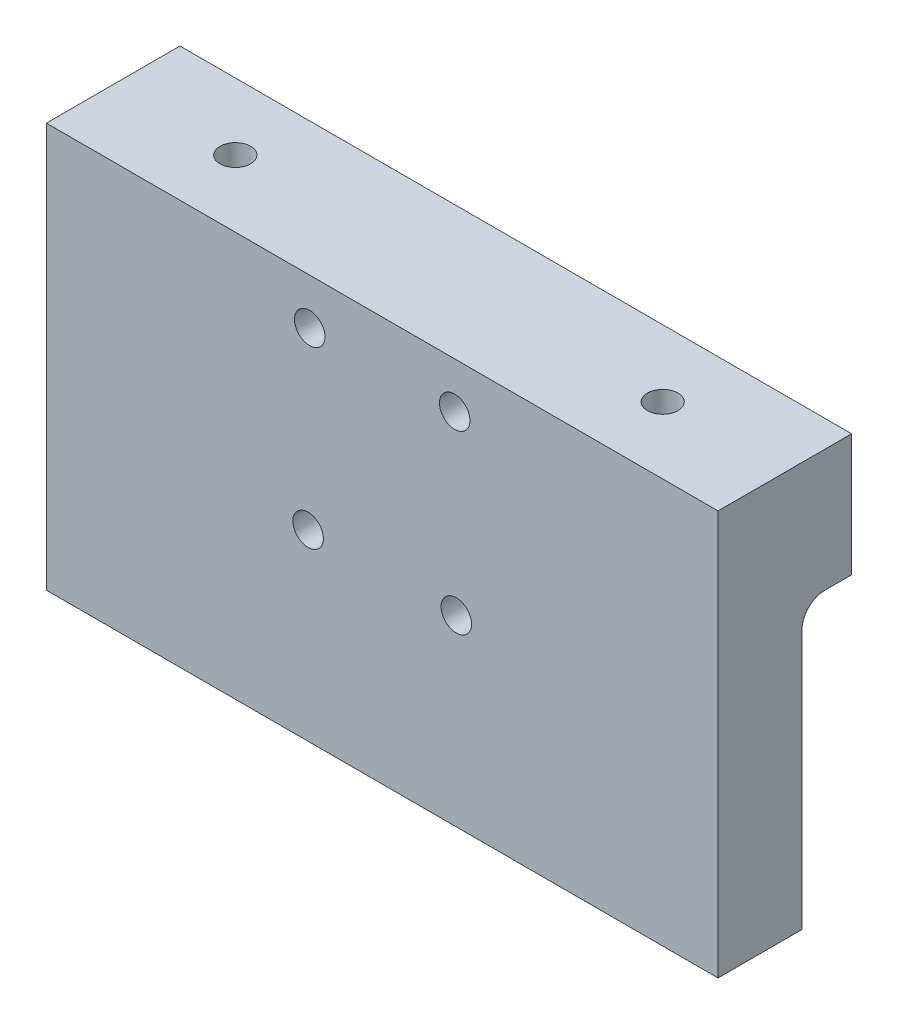
ISO-10303-21;
HEADER;
FILE_DESCRIPTION(('STEP AP214'),'2;1');
FILE_NAME('part.step','',(''),(''),'','','');
FILE_SCHEMA(('AUTOMOTIVE_DESIGN { 1 0 10303 214 1 1 1 1 }'));
ENDSEC;
DATA;
#1=APPLICATION_CONTEXT('core data for automotive mechanical design processes');
#2=APPLICATION_PROTOCOL_DEFINITION('international standard','automotive_design',2000,#1);
#3=PRODUCT_CONTEXT('',#1,'mechanical');
#4=PRODUCT('Part','Part','',(#3));
#5=PRODUCT_RELATED_PRODUCT_CATEGORY('part','',(#4));
#6=PRODUCT_DEFINITION_FORMATION('','',#4);
#7=PRODUCT_DEFINITION_CONTEXT('part definition',#1,'design');
#8=PRODUCT_DEFINITION('design','',#6,#7);
#9=PRODUCT_DEFINITION_SHAPE('','',#8);
#10=(LENGTH_UNIT() NAMED_UNIT(*) SI_UNIT(.MILLI.,.METRE.));
#11=(NAMED_UNIT(*) PLANE_ANGLE_UNIT() SI_UNIT($,.RADIAN.));
#12=(NAMED_UNIT(*) SI_UNIT($,.STERADIAN.) SOLID_ANGLE_UNIT());
#13=UNCERTAINTY_MEASURE_WITH_UNIT(LENGTH_MEASURE(1.E-05),#10,'distance_accuracy_value','');
#14=(GEOMETRIC_REPRESENTATION_CONTEXT(3) GLOBAL_UNCERTAINTY_ASSIGNED_CONTEXT((#13)) GLOBAL_UNIT_ASSIGNED_CONTEXT((#10,
#11,#12)) REPRESENTATION_CONTEXT('',''));
#15=CARTESIAN_POINT('',(0.,0.,0.));
#16=DIRECTION('',(0.,0.,1.));
#17=DIRECTION('',(1.,0.,0.));
#18=AXIS2_PLACEMENT_3D('',#15,#16,#17);
#19=CARTESIAN_POINT('',(176.,53.,11.));
#20=DIRECTION('',(0.,0.,-1.));
#21=DIRECTION('',(0.,1.,0.));
#22=AXIS2_PLACEMENT_3D('',#19,#20,#21);
#23=PLANE('',#22);
#24=CARTESIAN_POINT('',(107.,41.,11.));
#25=DIRECTION('',(0.,0.,-1.));
#26=DIRECTION('',(0.,1.,0.));
#27=AXIS2_PLACEMENT_3D('',#24,#25,#26);
#28=CIRCLE('',#27,4.00000000000001);
#29=CARTESIAN_POINT('',(107.,45.,11.));
#30=VERTEX_POINT('',#29);
#31=EDGE_CURVE('E155',#30,#30,#28,.T.);
#32=ORIENTED_EDGE('',*,*,#31,.T.);
#33=EDGE_LOOP('',(#32));
#34=FACE_BOUND('',#33,.T.);
#35=CARTESIAN_POINT('',(68.5806110348248,-5.00000000000001,11.));
#36=DIRECTION('',(0.,0.,-1.));
#37=DIRECTION('',(0.,1.,0.));
#38=AXIS2_PLACEMENT_3D('',#35,#36,#37);
#39=CIRCLE('',#38,4.00000000000001);
#40=CARTESIAN_POINT('',(68.5806110348248,-0.999999999999999,11.));
#41=VERTEX_POINT('',#40);
#42=EDGE_CURVE('E129',#41,#41,#39,.T.);
#43=ORIENTED_EDGE('',*,*,#42,.T.);
#44=EDGE_LOOP('',(#43));
#45=FACE_BOUND('',#44,.T.);
#46=CARTESIAN_POINT('',(107.419388965175,-5.00000000000001,11.));
#47=DIRECTION('',(0.,0.,-1.));
#48=DIRECTION('',(0.,1.,0.));
#49=AXIS2_PLACEMENT_3D('',#46,#47,#48);
#50=CIRCLE('',#49,4.00000000000001);
#51=CARTESIAN_POINT('',(107.419388965175,-0.999999999999999,11.));
#52=VERTEX_POINT('',#51);
#53=EDGE_CURVE('E158',#52,#52,#50,.T.);
#54=ORIENTED_EDGE('',*,*,#53,.T.);
#55=EDGE_LOOP('',(#54));
#56=FACE_BOUND('',#55,.T.);
#57=CARTESIAN_POINT('',(69.,41.,11.));
#58=DIRECTION('',(0.,0.,-1.));
#59=DIRECTION('',(0.,1.,0.));
#60=AXIS2_PLACEMENT_3D('',#57,#58,#59);
#61=CIRCLE('',#60,4.00000000000001);
#62=CARTESIAN_POINT('',(69.,45.,11.));
#63=VERTEX_POINT('',#62);
#64=EDGE_CURVE('E151',#63,#63,#61,.T.);
#65=ORIENTED_EDGE('',*,*,#64,.T.);
#66=EDGE_LOOP('',(#65));
#67=FACE_BOUND('',#66,.T.);
#68=DIRECTION('',(0.,-1.,0.));
#69=VECTOR('',#68,1.);
#70=CARTESIAN_POINT('',(0.,53.,11.));
#71=LINE('',#70,#69);
#72=CARTESIAN_POINT('',(0.,53.,11.));
#73=VERTEX_POINT('',#72);
#74=CARTESIAN_POINT('',(0.,-53.,11.));
#75=VERTEX_POINT('',#74);
#76=EDGE_CURVE('E125',#73,#75,#71,.T.);
#77=ORIENTED_EDGE('',*,*,#76,.T.);
#78=DIRECTION('',(-1.,0.,0.));
#79=VECTOR('',#78,1.);
#80=CARTESIAN_POINT('',(176.,-53.,11.));
#81=LINE('',#80,#79);
#82=CARTESIAN_POINT('',(176.,-53.,11.));
#83=VERTEX_POINT('',#82);
#84=EDGE_CURVE('E11',#83,#75,#81,.T.);
#85=ORIENTED_EDGE('',*,*,#84,.F.);
#86=DIRECTION('',(0.,-1.,0.));
#87=VECTOR('',#86,1.);
#88=CARTESIAN_POINT('',(176.,53.,11.));
#89=LINE('',#88,#87);
#90=CARTESIAN_POINT('',(176.,53.,11.));
#91=VERTEX_POINT('',#90);
#92=EDGE_CURVE('E139',#91,#83,#89,.T.);
#93=ORIENTED_EDGE('',*,*,#92,.F.);
#94=DIRECTION('',(-1.,0.,0.));
#95=VECTOR('',#94,1.);
#96=CARTESIAN_POINT('',(176.,53.,11.));
#97=LINE('',#96,#95);
#98=EDGE_CURVE('E121',#91,#73,#97,.T.);
#99=ORIENTED_EDGE('',*,*,#98,.T.);
#100=EDGE_LOOP('',(#77,#85,#93,#99));
#101=FACE_BOUND('',#100,.T.);
#102=ADVANCED_FACE('F32',(#34,#45,#56,#67,#101),#23,.F.);
#103=CARTESIAN_POINT('',(176.,-53.,-11.));
#104=DIRECTION('',(0.,1.,0.));
#105=DIRECTION('',(0.,0.,1.));
#106=AXIS2_PLACEMENT_3D('',#103,#104,#105);
#107=PLANE('',#106);
#108=DIRECTION('',(0.,0.,-1.));
#109=VECTOR('',#108,1.);
#110=CARTESIAN_POINT('',(0.,-53.,-11.));
#111=LINE('',#110,#109);
#112=CARTESIAN_POINT('',(0.,-53.,-11.));
#113=VERTEX_POINT('',#112);
#114=EDGE_CURVE('E128',#75,#113,#111,.T.);
#115=ORIENTED_EDGE('',*,*,#114,.T.);
#116=DIRECTION('',(-1.,0.,0.));
#117=VECTOR('',#116,1.);
#118=CARTESIAN_POINT('',(176.,-53.,-11.));
#119=LINE('',#118,#117);
#120=CARTESIAN_POINT('',(176.,-53.,-11.));
#121=VERTEX_POINT('',#120);
#122=EDGE_CURVE('E41',#121,#113,#119,.T.);
#123=ORIENTED_EDGE('',*,*,#122,.F.);
#124=DIRECTION('',(0.,0.,-1.));
#125=VECTOR('',#124,1.);
#126=CARTESIAN_POINT('',(176.,-53.,-11.));
#127=LINE('',#126,#125);
#128=EDGE_CURVE('E88',#83,#121,#127,.T.);
#129=ORIENTED_EDGE('',*,*,#128,.F.);
#130=ORIENTED_EDGE('',*,*,#84,.T.);
#131=EDGE_LOOP('',(#115,#123,#129,#130));
#132=FACE_BOUND('',#131,.T.);
#133=ADVANCED_FACE('F188',(#132),#107,.F.);
#134=CARTESIAN_POINT('',(176.,14.9999999999999,-11.));
#135=DIRECTION('',(0.,0.,1.));
#136=DIRECTION('',(0.,-1.,0.));
#137=AXIS2_PLACEMENT_3D('',#134,#135,#136);
#138=PLANE('',#137);
#139=CARTESIAN_POINT('',(68.5806110348248,-5.,-11.));
#140=DIRECTION('',(0.,0.,1.));
#141=DIRECTION('',(0.,-1.,0.));
#142=AXIS2_PLACEMENT_3D('',#139,#140,#141);
#143=CIRCLE('',#142,4.00000000000001);
#144=CARTESIAN_POINT('',(68.5806110348248,-0.999999999999996,-11.));
#145=VERTEX_POINT('',#144);
#146=EDGE_CURVE('E35',#145,#145,#143,.T.);
#147=ORIENTED_EDGE('',*,*,#146,.T.);
#148=EDGE_LOOP('',(#147));
#149=FACE_BOUND('',#148,.T.);
#150=CARTESIAN_POINT('',(107.419388965175,-5.,-11.));
#151=DIRECTION('',(0.,0.,1.));
#152=DIRECTION('',(0.,-1.,0.));
#153=AXIS2_PLACEMENT_3D('',#150,#151,#152);
#154=CIRCLE('',#153,4.00000000000001);
#155=CARTESIAN_POINT('',(107.419388965175,-0.999999999999996,-11.));
#156=VERTEX_POINT('',#155);
#157=EDGE_CURVE('E156',#156,#156,#154,.T.);
#158=ORIENTED_EDGE('',*,*,#157,.T.);
#159=EDGE_LOOP('',(#158));
#160=FACE_BOUND('',#159,.T.);
#161=DIRECTION('',(0.,1.,0.));
#162=VECTOR('',#161,1.);
#163=CARTESIAN_POINT('',(0.,14.9999999999999,-11.));
#164=LINE('',#163,#162);
#165=CARTESIAN_POINT('',(0.,14.9999999999999,-11.));
#166=VERTEX_POINT('',#165);
#167=EDGE_CURVE('E131',#113,#166,#164,.T.);
#168=ORIENTED_EDGE('',*,*,#167,.T.);
#169=DIRECTION('',(-1.,0.,0.));
#170=VECTOR('',#169,1.);
#171=CARTESIAN_POINT('',(176.,14.9999999999999,-11.));
#172=LINE('',#171,#170);
#173=CARTESIAN_POINT('',(176.,14.9999999999999,-11.));
#174=VERTEX_POINT('',#173);
#175=EDGE_CURVE('E143',#174,#166,#172,.T.);
#176=ORIENTED_EDGE('',*,*,#175,.F.);
#177=DIRECTION('',(0.,1.,0.));
#178=VECTOR('',#177,1.);
#179=CARTESIAN_POINT('',(176.,14.9999999999999,-11.));
#180=LINE('',#179,#178);
#181=EDGE_CURVE('E174',#121,#174,#180,.T.);
#182=ORIENTED_EDGE('',*,*,#181,.F.);
#183=ORIENTED_EDGE('',*,*,#122,.T.);
#184=EDGE_LOOP('',(#168,#176,#182,#183));
#185=FACE_BOUND('',#184,.T.);
#186=ADVANCED_FACE('F178',(#149,#160,#185),#138,.F.);
#187=CARTESIAN_POINT('',(176.,15.,-17.));
#188=DIRECTION('',(-1.,0.,0.));
#189=DIRECTION('',(0.,0.,1.));
#190=AXIS2_PLACEMENT_3D('',#187,#188,#189);
#191=CYLINDRICAL_SURFACE('',#190,6.);
#192=CARTESIAN_POINT('',(0.,15.,-17.));
#193=DIRECTION('',(-1.,0.,0.));
#194=DIRECTION('',(0.,0.,-1.));
#195=AXIS2_PLACEMENT_3D('',#192,#193,#194);
#196=CIRCLE('',#195,6.);
#197=CARTESIAN_POINT('',(0.,21.,-17.));
#198=VERTEX_POINT('',#197);
#199=EDGE_CURVE('E133',#166,#198,#196,.T.);
#200=ORIENTED_EDGE('',*,*,#199,.T.);
#201=DIRECTION('',(-1.,0.,0.));
#202=VECTOR('',#201,1.);
#203=CARTESIAN_POINT('',(176.,21.,-17.));
#204=LINE('',#203,#202);
#205=CARTESIAN_POINT('',(176.,21.,-17.));
#206=VERTEX_POINT('',#205);
#207=EDGE_CURVE('E116',#206,#198,#204,.T.);
#208=ORIENTED_EDGE('',*,*,#207,.F.);
#209=CARTESIAN_POINT('',(176.,15.,-17.));
#210=DIRECTION('',(-1.,0.,0.));
#211=DIRECTION('',(0.,0.,-1.));
#212=AXIS2_PLACEMENT_3D('',#209,#210,#211);
#213=CIRCLE('',#212,6.);
#214=EDGE_CURVE('E105',#174,#206,#213,.T.);
#215=ORIENTED_EDGE('',*,*,#214,.F.);
#216=ORIENTED_EDGE('',*,*,#175,.T.);
#217=EDGE_LOOP('',(#200,#208,#215,#216));
#218=FACE_BOUND('',#217,.T.);
#219=ADVANCED_FACE('F182',(#218),#191,.F.);
#220=CARTESIAN_POINT('',(176.,21.,-17.));
#221=DIRECTION('',(0.,1.,0.));
#222=DIRECTION('',(0.,0.,1.));
#223=AXIS2_PLACEMENT_3D('',#220,#221,#222);
#224=PLANE('',#223);
#225=DIRECTION('',(0.,0.,-1.));
#226=VECTOR('',#225,1.);
#227=CARTESIAN_POINT('',(0.,21.,-17.));
#228=LINE('',#227,#226);
#229=CARTESIAN_POINT('',(0.,21.,-24.));
#230=VERTEX_POINT('',#229);
#231=EDGE_CURVE('E114',#198,#230,#228,.T.);
#232=ORIENTED_EDGE('',*,*,#231,.T.);
#233=DIRECTION('',(-1.,0.,0.));
#234=VECTOR('',#233,1.);
#235=CARTESIAN_POINT('',(176.,21.,-24.));
#236=LINE('',#235,#234);
#237=CARTESIAN_POINT('',(176.,21.,-24.));
#238=VERTEX_POINT('',#237);
#239=EDGE_CURVE('E111',#238,#230,#236,.T.);
#240=ORIENTED_EDGE('',*,*,#239,.F.);
#241=DIRECTION('',(0.,0.,-1.));
#242=VECTOR('',#241,1.);
#243=CARTESIAN_POINT('',(176.,21.,-17.));
#244=LINE('',#243,#242);
#245=EDGE_CURVE('E98',#206,#238,#244,.T.);
#246=ORIENTED_EDGE('',*,*,#245,.F.);
#247=ORIENTED_EDGE('',*,*,#207,.T.);
#248=EDGE_LOOP('',(#232,#240,#246,#247));
#249=FACE_BOUND('',#248,.T.);
#250=ADVANCED_FACE('F112',(#249),#224,.F.);
#251=CARTESIAN_POINT('',(176.,53.,-24.));
#252=DIRECTION('',(0.,0.,1.));
#253=DIRECTION('',(0.,-1.,0.));
#254=AXIS2_PLACEMENT_3D('',#251,#252,#253);
#255=PLANE('',#254);
#256=CARTESIAN_POINT('',(107.,41.,-24.));
#257=DIRECTION('',(0.,0.,1.));
#258=DIRECTION('',(0.,-1.,0.));
#259=AXIS2_PLACEMENT_3D('',#256,#257,#258);
#260=CIRCLE('',#259,4.00000000000001);
#261=CARTESIAN_POINT('',(107.,45.,-24.));
#262=VERTEX_POINT('',#261);
#263=EDGE_CURVE('E153',#262,#262,#260,.T.);
#264=ORIENTED_EDGE('',*,*,#263,.T.);
#265=EDGE_LOOP('',(#264));
#266=FACE_BOUND('',#265,.T.);
#267=CARTESIAN_POINT('',(69.,41.,-24.));
#268=DIRECTION('',(0.,0.,1.));
#269=DIRECTION('',(0.,-1.,0.));
#270=AXIS2_PLACEMENT_3D('',#267,#268,#269);
#271=CIRCLE('',#270,4.00000000000001);
#272=CARTESIAN_POINT('',(69.,45.,-24.));
#273=VERTEX_POINT('',#272);
#274=EDGE_CURVE('E148',#273,#273,#271,.T.);
#275=ORIENTED_EDGE('',*,*,#274,.T.);
#276=EDGE_LOOP('',(#275));
#277=FACE_BOUND('',#276,.T.);
#278=DIRECTION('',(0.,1.,0.));
#279=VECTOR('',#278,1.);
#280=CARTESIAN_POINT('',(0.,53.,-24.));
#281=LINE('',#280,#279);
#282=CARTESIAN_POINT('',(0.,53.,-24.));
#283=VERTEX_POINT('',#282);
#284=EDGE_CURVE('E136',#230,#283,#281,.T.);
#285=ORIENTED_EDGE('',*,*,#284,.T.);
#286=DIRECTION('',(-1.,0.,0.));
#287=VECTOR('',#286,1.);
#288=CARTESIAN_POINT('',(176.,53.,-24.));
#289=LINE('',#288,#287);
#290=CARTESIAN_POINT('',(176.,53.,-24.));
#291=VERTEX_POINT('',#290);
#292=EDGE_CURVE('E117',#291,#283,#289,.T.);
#293=ORIENTED_EDGE('',*,*,#292,.F.);
#294=DIRECTION('',(0.,1.,0.));
#295=VECTOR('',#294,1.);
#296=CARTESIAN_POINT('',(176.,53.,-24.));
#297=LINE('',#296,#295);
#298=EDGE_CURVE('E102',#238,#291,#297,.T.);
#299=ORIENTED_EDGE('',*,*,#298,.F.);
#300=ORIENTED_EDGE('',*,*,#239,.T.);
#301=EDGE_LOOP('',(#285,#293,#299,#300));
#302=FACE_BOUND('',#301,.T.);
#303=ADVANCED_FACE('F119',(#266,#277,#302),#255,.F.);
#304=CARTESIAN_POINT('',(176.,53.,-11.));
#305=DIRECTION('',(0.,-1.,0.));
#306=DIRECTION('',(0.,0.,-1.));
#307=AXIS2_PLACEMENT_3D('',#304,#305,#306);
#308=PLANE('',#307);
#309=CARTESIAN_POINT('',(32.,53.,-6.49999999999999));
#310=DIRECTION('',(0.,1.,0.));
#311=DIRECTION('',(0.,0.,1.));
#312=AXIS2_PLACEMENT_3D('',#309,#310,#311);
#313=CIRCLE('',#312,4.00000000000001);
#314=CARTESIAN_POINT('',(32.,53.,-2.49999999999999));
#315=VERTEX_POINT('',#314);
#316=EDGE_CURVE('E246',#315,#315,#313,.T.);
#317=ORIENTED_EDGE('',*,*,#316,.F.);
#318=EDGE_LOOP('',(#317));
#319=FACE_BOUND('',#318,.T.);
#320=CARTESIAN_POINT('',(144.,53.,-6.49999999999999));
#321=DIRECTION('',(0.,1.,0.));
#322=DIRECTION('',(0.,0.,-1.));
#323=AXIS2_PLACEMENT_3D('',#320,#321,#322);
#324=CIRCLE('',#323,3.99999999999999);
#325=CARTESIAN_POINT('',(144.,53.,-10.5));
#326=VERTEX_POINT('',#325);
#327=EDGE_CURVE('E253',#326,#326,#324,.T.);
#328=ORIENTED_EDGE('',*,*,#327,.F.);
#329=EDGE_LOOP('',(#328));
#330=FACE_BOUND('',#329,.T.);
#331=DIRECTION('',(0.,0.,1.));
#332=VECTOR('',#331,1.);
#333=CARTESIAN_POINT('',(0.,53.,-11.));
#334=LINE('',#333,#332);
#335=EDGE_CURVE('E76',#283,#73,#334,.T.);
#336=ORIENTED_EDGE('',*,*,#335,.T.);
#337=ORIENTED_EDGE('',*,*,#98,.F.);
#338=DIRECTION('',(0.,0.,1.));
#339=VECTOR('',#338,1.);
#340=CARTESIAN_POINT('',(176.,53.,-11.));
#341=LINE('',#340,#339);
#342=EDGE_CURVE('E50',#291,#91,#341,.T.);
#343=ORIENTED_EDGE('',*,*,#342,.F.);
#344=ORIENTED_EDGE('',*,*,#292,.T.);
#345=EDGE_LOOP('',(#336,#337,#343,#344));
#346=FACE_BOUND('',#345,.T.);
#347=ADVANCED_FACE('F184',(#319,#330,#346),#308,.F.);
#348=CARTESIAN_POINT('',(176.,15.,-17.));
#349=DIRECTION('',(1.,0.,0.));
#350=DIRECTION('',(0.,0.,-1.));
#351=AXIS2_PLACEMENT_3D('',#348,#349,#350);
#352=PLANE('',#351);
#353=ORIENTED_EDGE('',*,*,#92,.T.);
#354=ORIENTED_EDGE('',*,*,#128,.T.);
#355=ORIENTED_EDGE('',*,*,#181,.T.);
#356=ORIENTED_EDGE('',*,*,#214,.T.);
#357=ORIENTED_EDGE('',*,*,#245,.T.);
#358=ORIENTED_EDGE('',*,*,#298,.T.);
#359=ORIENTED_EDGE('',*,*,#342,.T.);
#360=EDGE_LOOP('',(#353,#354,#355,#356,#357,#358,#359));
#361=FACE_BOUND('',#360,.T.);
#362=ADVANCED_FACE('F100',(#361),#352,.T.);
#363=CARTESIAN_POINT('',(0.,15.,-17.));
#364=DIRECTION('',(1.,0.,0.));
#365=DIRECTION('',(0.,0.,-1.));
#366=AXIS2_PLACEMENT_3D('',#363,#364,#365);
#367=PLANE('',#366);
#368=ORIENTED_EDGE('',*,*,#76,.F.);
#369=ORIENTED_EDGE('',*,*,#335,.F.);
#370=ORIENTED_EDGE('',*,*,#284,.F.);
#371=ORIENTED_EDGE('',*,*,#231,.F.);
#372=ORIENTED_EDGE('',*,*,#199,.F.);
#373=ORIENTED_EDGE('',*,*,#167,.F.);
#374=ORIENTED_EDGE('',*,*,#114,.F.);
#375=EDGE_LOOP('',(#368,#369,#370,#371,#372,#373,#374));
#376=FACE_BOUND('',#375,.T.);
#377=ADVANCED_FACE('F183',(#376),#367,.F.);
#378=CARTESIAN_POINT('',(69.,41.,79.));
#379=DIRECTION('',(0.,0.,-1.));
#380=DIRECTION('',(0.,1.,0.));
#381=AXIS2_PLACEMENT_3D('',#378,#379,#380);
#382=CYLINDRICAL_SURFACE('',#381,4.00000000000001);
#383=CARTESIAN_POINT('',(69.,45.,-24.));
#384=CARTESIAN_POINT('',(69.,45.,-23.6354166666666));
#385=CARTESIAN_POINT('',(69.,45.,-23.2708333333333));
#386=CARTESIAN_POINT('',(69.,45.,-22.5416666666666));
#387=CARTESIAN_POINT('',(69.,45.,-22.1770833333333));
#388=CARTESIAN_POINT('',(69.,45.,-21.4479166666667));
#389=CARTESIAN_POINT('',(69.,45.,-21.0833333333333));
#390=CARTESIAN_POINT('',(69.,45.,-20.3541666666666));
#391=CARTESIAN_POINT('',(69.,45.,-19.9895833333333));
#392=CARTESIAN_POINT('',(69.,45.,-19.2604166666666));
#393=CARTESIAN_POINT('',(69.,45.,-18.8958333333333));
#394=CARTESIAN_POINT('',(69.,45.,-18.1666666666667));
#395=CARTESIAN_POINT('',(69.,45.,-17.8020833333333));
#396=CARTESIAN_POINT('',(69.,45.,-17.0729166666666));
#397=CARTESIAN_POINT('',(69.,45.,-16.7083333333333));
#398=CARTESIAN_POINT('',(69.,45.,-15.9791666666666));
#399=CARTESIAN_POINT('',(69.,45.,-15.6145833333333));
#400=CARTESIAN_POINT('',(69.,45.,-14.8854166666666));
#401=CARTESIAN_POINT('',(69.,45.,-14.5208333333333));
#402=CARTESIAN_POINT('',(69.,45.,-13.7916666666666));
#403=CARTESIAN_POINT('',(69.,45.,-13.4270833333333));
#404=CARTESIAN_POINT('',(69.,45.,-12.6979166666666));
#405=CARTESIAN_POINT('',(69.,45.,-12.3333333333333));
#406=CARTESIAN_POINT('',(69.,45.,-11.6041666666667));
#407=CARTESIAN_POINT('',(69.,45.,-11.2395833333333));
#408=CARTESIAN_POINT('',(69.,45.,-10.5104166666666));
#409=CARTESIAN_POINT('',(69.,45.,-10.1458333333333));
#410=CARTESIAN_POINT('',(69.,45.,-9.41666666666664));
#411=CARTESIAN_POINT('',(69.,45.,-9.05208333333331));
#412=CARTESIAN_POINT('',(69.,45.,-8.32291666666664));
#413=CARTESIAN_POINT('',(69.,45.,-7.95833333333331));
#414=CARTESIAN_POINT('',(69.,45.,-7.22916666666665));
#415=CARTESIAN_POINT('',(69.,45.,-6.86458333333331));
#416=CARTESIAN_POINT('',(69.,45.,-6.13541666666664));
#417=CARTESIAN_POINT('',(69.,45.,-5.77083333333331));
#418=CARTESIAN_POINT('',(69.,45.,-5.04166666666664));
#419=CARTESIAN_POINT('',(69.,45.,-4.67708333333331));
#420=CARTESIAN_POINT('',(69.,45.,-3.94791666666665));
#421=CARTESIAN_POINT('',(69.,45.,-3.58333333333331));
#422=CARTESIAN_POINT('',(69.,45.,-2.85416666666664));
#423=CARTESIAN_POINT('',(69.,45.,-2.48958333333331));
#424=CARTESIAN_POINT('',(69.,45.,-1.76041666666664));
#425=CARTESIAN_POINT('',(69.,45.,-1.3958333333333));
#426=CARTESIAN_POINT('',(69.,45.,-0.666666666666639));
#427=CARTESIAN_POINT('',(69.,45.,-0.302083333333309));
#428=CARTESIAN_POINT('',(69.,45.,0.427083333333356));
#429=CARTESIAN_POINT('',(69.,45.,0.79166666666669));
#430=CARTESIAN_POINT('',(69.,45.,1.52083333333336));
#431=CARTESIAN_POINT('',(69.,45.,1.88541666666669));
#432=CARTESIAN_POINT('',(69.,45.,2.61458333333335));
#433=CARTESIAN_POINT('',(69.,45.,2.97916666666669));
#434=CARTESIAN_POINT('',(69.,45.,3.70833333333336));
#435=CARTESIAN_POINT('',(69.,45.,4.07291666666669));
#436=CARTESIAN_POINT('',(69.,45.,4.80208333333336));
#437=CARTESIAN_POINT('',(69.,45.,5.16666666666669));
#438=CARTESIAN_POINT('',(69.,45.,5.89583333333336));
#439=CARTESIAN_POINT('',(69.,45.,6.26041666666669));
#440=CARTESIAN_POINT('',(69.,45.,6.98958333333335));
#441=CARTESIAN_POINT('',(69.,45.,7.35416666666669));
#442=CARTESIAN_POINT('',(69.,45.,8.08333333333335));
#443=CARTESIAN_POINT('',(69.,45.,8.44791666666669));
#444=CARTESIAN_POINT('',(69.,45.,9.17708333333335));
#445=CARTESIAN_POINT('',(69.,45.,9.54166666666668));
#446=CARTESIAN_POINT('',(69.,45.,10.2708333333334));
#447=CARTESIAN_POINT('',(69.,45.,10.6354166666667));
#448=CARTESIAN_POINT('',(69.,45.,11.));
#449=B_SPLINE_CURVE_WITH_KNOTS('',3,(#383,#384,#385,#386,#387,#388,#389,#390,#391,#392,#393,
#394,#395,#396,#397,#398,#399,#400,#401,#402,#403,#404,#405,#406,#407,#408,#409,#410,#411,#412,
#413,#414,#415,#416,#417,#418,#419,#420,#421,#422,#423,#424,#425,#426,#427,#428,#429,#430,#431,
#432,#433,#434,#435,#436,#437,#438,#439,#440,#441,#442,#443,#444,#445,#446,#447,#448),
.UNSPECIFIED.,.F.,.F.,(4,2,2,2,2,2,2,2,2,2,2,2,2,2,2,2,2,2,2,2,2,2,2,2,2,2,2,2,2,2,2,2,4),(0.,
1.09375,2.1875,3.28125,4.375,5.46874999999999,6.5625,7.65625,8.75000000000001,9.84375,10.9375,
12.03125,13.125,14.21875,15.3125,16.40625,17.5,18.59375,19.6875,20.78125,21.875,22.96875,
24.0625,25.15625,26.25,27.34375,28.4375,29.53125,30.625,31.71875,32.8125,33.90625,35.),.UNSPECIFIED.);
#450=EDGE_CURVE('BSEAM209',#273,#63,#449,.T.);
#451=ORIENTED_EDGE('',*,*,#274,.F.);
#452=ORIENTED_EDGE('',*,*,#64,.F.);
#453=ORIENTED_EDGE('',*,*,#450,.T.);
#454=ORIENTED_EDGE('',*,*,#450,.F.);
#455=EDGE_LOOP('',(#451,#453,#452,#454));
#456=FACE_BOUND('',#455,.T.);
#457=ADVANCED_FACE('F209',(#456),#382,.F.);
#458=CARTESIAN_POINT('',(107.,41.,79.));
#459=DIRECTION('',(0.,0.,-1.));
#460=DIRECTION('',(0.,1.,0.));
#461=AXIS2_PLACEMENT_3D('',#458,#459,#460);
#462=CYLINDRICAL_SURFACE('',#461,4.00000000000001);
#463=CARTESIAN_POINT('',(107.,45.,-24.));
#464=CARTESIAN_POINT('',(107.,45.,-23.6354166666666));
#465=CARTESIAN_POINT('',(107.,45.,-23.2708333333333));
#466=CARTESIAN_POINT('',(107.,45.,-22.5416666666666));
#467=CARTESIAN_POINT('',(107.,45.,-22.1770833333333));
#468=CARTESIAN_POINT('',(107.,45.,-21.4479166666667));
#469=CARTESIAN_POINT('',(107.,45.,-21.0833333333333));
#470=CARTESIAN_POINT('',(107.,45.,-20.3541666666666));
#471=CARTESIAN_POINT('',(107.,45.,-19.9895833333333));
#472=CARTESIAN_POINT('',(107.,45.,-19.2604166666666));
#473=CARTESIAN_POINT('',(107.,45.,-18.8958333333333));
#474=CARTESIAN_POINT('',(107.,45.,-18.1666666666667));
#475=CARTESIAN_POINT('',(107.,45.,-17.8020833333333));
#476=CARTESIAN_POINT('',(107.,45.,-17.0729166666666));
#477=CARTESIAN_POINT('',(107.,45.,-16.7083333333333));
#478=CARTESIAN_POINT('',(107.,45.,-15.9791666666666));
#479=CARTESIAN_POINT('',(107.,45.,-15.6145833333333));
#480=CARTESIAN_POINT('',(107.,45.,-14.8854166666666));
#481=CARTESIAN_POINT('',(107.,45.,-14.5208333333333));
#482=CARTESIAN_POINT('',(107.,45.,-13.7916666666666));
#483=CARTESIAN_POINT('',(107.,45.,-13.4270833333333));
#484=CARTESIAN_POINT('',(107.,45.,-12.6979166666666));
#485=CARTESIAN_POINT('',(107.,45.,-12.3333333333333));
#486=CARTESIAN_POINT('',(107.,45.,-11.6041666666667));
#487=CARTESIAN_POINT('',(107.,45.,-11.2395833333333));
#488=CARTESIAN_POINT('',(107.,45.,-10.5104166666666));
#489=CARTESIAN_POINT('',(107.,45.,-10.1458333333333));
#490=CARTESIAN_POINT('',(107.,45.,-9.41666666666664));
#491=CARTESIAN_POINT('',(107.,45.,-9.05208333333331));
#492=CARTESIAN_POINT('',(107.,45.,-8.32291666666664));
#493=CARTESIAN_POINT('',(107.,45.,-7.95833333333331));
#494=CARTESIAN_POINT('',(107.,45.,-7.22916666666665));
#495=CARTESIAN_POINT('',(107.,45.,-6.86458333333331));
#496=CARTESIAN_POINT('',(107.,45.,-6.13541666666664));
#497=CARTESIAN_POINT('',(107.,45.,-5.77083333333331));
#498=CARTESIAN_POINT('',(107.,45.,-5.04166666666664));
#499=CARTESIAN_POINT('',(107.,45.,-4.67708333333331));
#500=CARTESIAN_POINT('',(107.,45.,-3.94791666666665));
#501=CARTESIAN_POINT('',(107.,45.,-3.58333333333331));
#502=CARTESIAN_POINT('',(107.,45.,-2.85416666666664));
#503=CARTESIAN_POINT('',(107.,45.,-2.48958333333331));
#504=CARTESIAN_POINT('',(107.,45.,-1.76041666666664));
#505=CARTESIAN_POINT('',(107.,45.,-1.3958333333333));
#506=CARTESIAN_POINT('',(107.,45.,-0.666666666666639));
#507=CARTESIAN_POINT('',(107.,45.,-0.302083333333309));
#508=CARTESIAN_POINT('',(107.,45.,0.427083333333356));
#509=CARTESIAN_POINT('',(107.,45.,0.79166666666669));
#510=CARTESIAN_POINT('',(107.,45.,1.52083333333336));
#511=CARTESIAN_POINT('',(107.,45.,1.88541666666669));
#512=CARTESIAN_POINT('',(107.,45.,2.61458333333335));
#513=CARTESIAN_POINT('',(107.,45.,2.97916666666669));
#514=CARTESIAN_POINT('',(107.,45.,3.70833333333336));
#515=CARTESIAN_POINT('',(107.,45.,4.07291666666669));
#516=CARTESIAN_POINT('',(107.,45.,4.80208333333336));
#517=CARTESIAN_POINT('',(107.,45.,5.16666666666669));
#518=CARTESIAN_POINT('',(107.,45.,5.89583333333336));
#519=CARTESIAN_POINT('',(107.,45.,6.26041666666669));
#520=CARTESIAN_POINT('',(107.,45.,6.98958333333335));
#521=CARTESIAN_POINT('',(107.,45.,7.35416666666669));
#522=CARTESIAN_POINT('',(107.,45.,8.08333333333335));
#523=CARTESIAN_POINT('',(107.,45.,8.44791666666669));
#524=CARTESIAN_POINT('',(107.,45.,9.17708333333335));
#525=CARTESIAN_POINT('',(107.,45.,9.54166666666668));
#526=CARTESIAN_POINT('',(107.,45.,10.2708333333334));
#527=CARTESIAN_POINT('',(107.,45.,10.6354166666667));
#528=CARTESIAN_POINT('',(107.,45.,11.));
#529=B_SPLINE_CURVE_WITH_KNOTS('',3,(#463,#464,#465,#466,#467,#468,#469,#470,#471,#472,#473,
#474,#475,#476,#477,#478,#479,#480,#481,#482,#483,#484,#485,#486,#487,#488,#489,#490,#491,#492,
#493,#494,#495,#496,#497,#498,#499,#500,#501,#502,#503,#504,#505,#506,#507,#508,#509,#510,#511,
#512,#513,#514,#515,#516,#517,#518,#519,#520,#521,#522,#523,#524,#525,#526,#527,#528),
.UNSPECIFIED.,.F.,.F.,(4,2,2,2,2,2,2,2,2,2,2,2,2,2,2,2,2,2,2,2,2,2,2,2,2,2,2,2,2,2,2,2,4),(0.,
1.09375,2.1875,3.28125,4.375,5.46874999999999,6.5625,7.65625,8.75000000000001,9.84375,10.9375,
12.03125,13.125,14.21875,15.3125,16.40625,17.5,18.59375,19.6875,20.78125,21.875,22.96875,
24.0625,25.15625,26.25,27.34375,28.4375,29.53125,30.625,31.71875,32.8125,33.90625,35.),.UNSPECIFIED.);
#530=EDGE_CURVE('BSEAM214',#262,#30,#529,.T.);
#531=ORIENTED_EDGE('',*,*,#263,.F.);
#532=ORIENTED_EDGE('',*,*,#31,.F.);
#533=ORIENTED_EDGE('',*,*,#530,.T.);
#534=ORIENTED_EDGE('',*,*,#530,.F.);
#535=EDGE_LOOP('',(#531,#533,#532,#534));
#536=FACE_BOUND('',#535,.T.);
#537=ADVANCED_FACE('F214',(#536),#462,.F.);
#538=CARTESIAN_POINT('',(107.419388965175,-5.00000000000001,79.));
#539=DIRECTION('',(0.,0.,-1.));
#540=DIRECTION('',(0.,1.,0.));
#541=AXIS2_PLACEMENT_3D('',#538,#539,#540);
#542=CYLINDRICAL_SURFACE('',#541,4.00000000000001);
#543=CARTESIAN_POINT('',(107.419388965175,-0.999999999999996,-11.));
#544=CARTESIAN_POINT('',(107.419388965175,-0.999999999999997,-10.7708333333333));
#545=CARTESIAN_POINT('',(107.419388965175,-0.999999999999997,-10.5416666666667));
#546=CARTESIAN_POINT('',(107.419388965175,-0.999999999999997,-10.0833333333333));
#547=CARTESIAN_POINT('',(107.419388965175,-0.999999999999997,-9.85416666666666));
#548=CARTESIAN_POINT('',(107.419388965175,-0.999999999999997,-9.39583333333333));
#549=CARTESIAN_POINT('',(107.419388965175,-0.999999999999997,-9.16666666666666));
#550=CARTESIAN_POINT('',(107.419388965175,-0.999999999999997,-8.70833333333333));
#551=CARTESIAN_POINT('',(107.419388965175,-0.999999999999997,-8.47916666666666));
#552=CARTESIAN_POINT('',(107.419388965175,-0.999999999999997,-8.02083333333333));
#553=CARTESIAN_POINT('',(107.419388965175,-0.999999999999997,-7.79166666666666));
#554=CARTESIAN_POINT('',(107.419388965175,-0.999999999999997,-7.33333333333332));
#555=CARTESIAN_POINT('',(107.419388965175,-0.999999999999997,-7.10416666666666));
#556=CARTESIAN_POINT('',(107.419388965175,-0.999999999999997,-6.64583333333333));
#557=CARTESIAN_POINT('',(107.419388965175,-0.999999999999997,-6.41666666666666));
#558=CARTESIAN_POINT('',(107.419388965175,-0.999999999999997,-5.95833333333333));
#559=CARTESIAN_POINT('',(107.419388965175,-0.999999999999997,-5.72916666666666));
#560=CARTESIAN_POINT('',(107.419388965175,-0.999999999999997,-5.27083333333332));
#561=CARTESIAN_POINT('',(107.419388965175,-0.999999999999997,-5.04166666666665));
#562=CARTESIAN_POINT('',(107.419388965175,-0.999999999999997,-4.58333333333332));
#563=CARTESIAN_POINT('',(107.419388965175,-0.999999999999997,-4.35416666666665));
#564=CARTESIAN_POINT('',(107.419388965175,-0.999999999999997,-3.89583333333333));
#565=CARTESIAN_POINT('',(107.419388965175,-0.999999999999997,-3.66666666666666));
#566=CARTESIAN_POINT('',(107.419388965175,-0.999999999999997,-3.20833333333333));
#567=CARTESIAN_POINT('',(107.419388965175,-0.999999999999997,-2.97916666666666));
#568=CARTESIAN_POINT('',(107.419388965175,-0.999999999999997,-2.52083333333332));
#569=CARTESIAN_POINT('',(107.419388965175,-0.999999999999997,-2.29166666666665));
#570=CARTESIAN_POINT('',(107.419388965175,-0.999999999999997,-1.83333333333332));
#571=CARTESIAN_POINT('',(107.419388965175,-0.999999999999998,-1.60416666666665));
#572=CARTESIAN_POINT('',(107.419388965175,-0.999999999999998,-1.14583333333332));
#573=CARTESIAN_POINT('',(107.419388965175,-0.999999999999998,-0.916666666666658));
#574=CARTESIAN_POINT('',(107.419388965175,-0.999999999999998,-0.458333333333324));
#575=CARTESIAN_POINT('',(107.419388965175,-0.999999999999998,-0.229166666666655));
#576=CARTESIAN_POINT('',(107.419388965175,-0.999999999999998,0.229166666666683));
#577=CARTESIAN_POINT('',(107.419388965175,-0.999999999999998,0.458333333333352));
#578=CARTESIAN_POINT('',(107.419388965175,-0.999999999999998,0.916666666666686));
#579=CARTESIAN_POINT('',(107.419388965175,-0.999999999999998,1.14583333333335));
#580=CARTESIAN_POINT('',(107.419388965175,-0.999999999999998,1.60416666666668));
#581=CARTESIAN_POINT('',(107.419388965175,-0.999999999999998,1.83333333333334));
#582=CARTESIAN_POINT('',(107.419388965175,-0.999999999999998,2.29166666666668));
#583=CARTESIAN_POINT('',(107.419388965175,-0.999999999999998,2.52083333333335));
#584=CARTESIAN_POINT('',(107.419388965175,-0.999999999999998,2.97916666666669));
#585=CARTESIAN_POINT('',(107.419388965175,-0.999999999999998,3.20833333333335));
#586=CARTESIAN_POINT('',(107.419388965175,-0.999999999999998,3.66666666666669));
#587=CARTESIAN_POINT('',(107.419388965175,-0.999999999999998,3.89583333333335));
#588=CARTESIAN_POINT('',(107.419388965175,-0.999999999999998,4.35416666666668));
#589=CARTESIAN_POINT('',(107.419388965175,-0.999999999999998,4.58333333333335));
#590=CARTESIAN_POINT('',(107.419388965175,-0.999999999999998,5.04166666666668));
#591=CARTESIAN_POINT('',(107.419388965175,-0.999999999999998,5.27083333333335));
#592=CARTESIAN_POINT('',(107.419388965175,-0.999999999999998,5.72916666666669));
#593=CARTESIAN_POINT('',(107.419388965175,-0.999999999999999,5.95833333333336));
#594=CARTESIAN_POINT('',(107.419388965175,-0.999999999999999,6.41666666666669));
#595=CARTESIAN_POINT('',(107.419388965175,-0.999999999999999,6.64583333333336));
#596=CARTESIAN_POINT('',(107.419388965175,-0.999999999999999,7.10416666666668));
#597=CARTESIAN_POINT('',(107.419388965175,-0.999999999999999,7.33333333333335));
#598=CARTESIAN_POINT('',(107.419388965175,-0.999999999999999,7.79166666666668));
#599=CARTESIAN_POINT('',(107.419388965175,-0.999999999999999,8.02083333333335));
#600=CARTESIAN_POINT('',(107.419388965175,-0.999999999999999,8.47916666666669));
#601=CARTESIAN_POINT('',(107.419388965175,-0.999999999999999,8.70833333333336));
#602=CARTESIAN_POINT('',(107.419388965175,-0.999999999999999,9.16666666666669));
#603=CARTESIAN_POINT('',(107.419388965175,-0.999999999999999,9.39583333333336));
#604=CARTESIAN_POINT('',(107.419388965175,-0.999999999999999,9.85416666666669));
#605=CARTESIAN_POINT('',(107.419388965175,-0.999999999999999,10.0833333333334));
#606=CARTESIAN_POINT('',(107.419388965175,-0.999999999999999,10.5416666666667));
#607=CARTESIAN_POINT('',(107.419388965175,-0.999999999999999,10.7708333333334));
#608=CARTESIAN_POINT('',(107.419388965175,-0.999999999999999,11.));
#609=B_SPLINE_CURVE_WITH_KNOTS('',3,(#543,#544,#545,#546,#547,#548,#549,#550,#551,#552,#553,
#554,#555,#556,#557,#558,#559,#560,#561,#562,#563,#564,#565,#566,#567,#568,#569,#570,#571,#572,
#573,#574,#575,#576,#577,#578,#579,#580,#581,#582,#583,#584,#585,#586,#587,#588,#589,#590,#591,
#592,#593,#594,#595,#596,#597,#598,#599,#600,#601,#602,#603,#604,#605,#606,#607,#608),
.UNSPECIFIED.,.F.,.F.,(4,2,2,2,2,2,2,2,2,2,2,2,2,2,2,2,2,2,2,2,2,2,2,2,2,2,2,2,2,2,2,2,4),(0.,
0.687500000000008,1.375,2.06249999999999,2.75,3.43750000000001,4.125,4.8125,5.50000000000001,
6.18750000000001,6.87500000000001,7.5625,8.25000000000001,8.93750000000001,9.62500000000001,
10.3125,11.,11.6875,12.375,13.0625,13.75,14.4375,15.125,15.8125,16.5,17.1875,17.875,18.5625,
19.25,19.9375,20.625,21.3125,22.),.UNSPECIFIED.);
#610=EDGE_CURVE('BSEAM220',#156,#52,#609,.T.);
#611=ORIENTED_EDGE('',*,*,#157,.F.);
#612=ORIENTED_EDGE('',*,*,#53,.F.);
#613=ORIENTED_EDGE('',*,*,#610,.T.);
#614=ORIENTED_EDGE('',*,*,#610,.F.);
#615=EDGE_LOOP('',(#611,#613,#612,#614));
#616=FACE_BOUND('',#615,.T.);
#617=ADVANCED_FACE('F220',(#616),#542,.F.);
#618=CARTESIAN_POINT('',(68.5806110348248,-5.00000000000001,79.));
#619=DIRECTION('',(0.,0.,-1.));
#620=DIRECTION('',(0.,1.,0.));
#621=AXIS2_PLACEMENT_3D('',#618,#619,#620);
#622=CYLINDRICAL_SURFACE('',#621,4.00000000000001);
#623=CARTESIAN_POINT('',(68.5806110348248,-0.999999999999996,-11.));
#624=CARTESIAN_POINT('',(68.5806110348248,-0.999999999999997,-10.7708333333333));
#625=CARTESIAN_POINT('',(68.5806110348248,-0.999999999999997,-10.5416666666667));
#626=CARTESIAN_POINT('',(68.5806110348248,-0.999999999999997,-10.0833333333333));
#627=CARTESIAN_POINT('',(68.5806110348248,-0.999999999999997,-9.85416666666666));
#628=CARTESIAN_POINT('',(68.5806110348248,-0.999999999999997,-9.39583333333333));
#629=CARTESIAN_POINT('',(68.5806110348248,-0.999999999999997,-9.16666666666666));
#630=CARTESIAN_POINT('',(68.5806110348248,-0.999999999999997,-8.70833333333333));
#631=CARTESIAN_POINT('',(68.5806110348248,-0.999999999999997,-8.47916666666666));
#632=CARTESIAN_POINT('',(68.5806110348248,-0.999999999999997,-8.02083333333333));
#633=CARTESIAN_POINT('',(68.5806110348248,-0.999999999999997,-7.79166666666666));
#634=CARTESIAN_POINT('',(68.5806110348248,-0.999999999999997,-7.33333333333332));
#635=CARTESIAN_POINT('',(68.5806110348248,-0.999999999999997,-7.10416666666666));
#636=CARTESIAN_POINT('',(68.5806110348248,-0.999999999999997,-6.64583333333333));
#637=CARTESIAN_POINT('',(68.5806110348248,-0.999999999999997,-6.41666666666666));
#638=CARTESIAN_POINT('',(68.5806110348248,-0.999999999999997,-5.95833333333333));
#639=CARTESIAN_POINT('',(68.5806110348248,-0.999999999999997,-5.72916666666666));
#640=CARTESIAN_POINT('',(68.5806110348248,-0.999999999999997,-5.27083333333332));
#641=CARTESIAN_POINT('',(68.5806110348248,-0.999999999999997,-5.04166666666665));
#642=CARTESIAN_POINT('',(68.5806110348248,-0.999999999999997,-4.58333333333332));
#643=CARTESIAN_POINT('',(68.5806110348248,-0.999999999999997,-4.35416666666665));
#644=CARTESIAN_POINT('',(68.5806110348248,-0.999999999999997,-3.89583333333333));
#645=CARTESIAN_POINT('',(68.5806110348248,-0.999999999999997,-3.66666666666666));
#646=CARTESIAN_POINT('',(68.5806110348248,-0.999999999999997,-3.20833333333333));
#647=CARTESIAN_POINT('',(68.5806110348248,-0.999999999999997,-2.97916666666666));
#648=CARTESIAN_POINT('',(68.5806110348248,-0.999999999999997,-2.52083333333332));
#649=CARTESIAN_POINT('',(68.5806110348248,-0.999999999999997,-2.29166666666665));
#650=CARTESIAN_POINT('',(68.5806110348248,-0.999999999999997,-1.83333333333332));
#651=CARTESIAN_POINT('',(68.5806110348248,-0.999999999999998,-1.60416666666665));
#652=CARTESIAN_POINT('',(68.5806110348248,-0.999999999999998,-1.14583333333332));
#653=CARTESIAN_POINT('',(68.5806110348248,-0.999999999999998,-0.916666666666658));
#654=CARTESIAN_POINT('',(68.5806110348248,-0.999999999999998,-0.458333333333324));
#655=CARTESIAN_POINT('',(68.5806110348248,-0.999999999999998,-0.229166666666655));
#656=CARTESIAN_POINT('',(68.5806110348248,-0.999999999999998,0.229166666666683));
#657=CARTESIAN_POINT('',(68.5806110348248,-0.999999999999998,0.458333333333352));
#658=CARTESIAN_POINT('',(68.5806110348248,-0.999999999999998,0.916666666666686));
#659=CARTESIAN_POINT('',(68.5806110348248,-0.999999999999998,1.14583333333335));
#660=CARTESIAN_POINT('',(68.5806110348248,-0.999999999999998,1.60416666666668));
#661=CARTESIAN_POINT('',(68.5806110348248,-0.999999999999998,1.83333333333334));
#662=CARTESIAN_POINT('',(68.5806110348248,-0.999999999999998,2.29166666666668));
#663=CARTESIAN_POINT('',(68.5806110348248,-0.999999999999998,2.52083333333335));
#664=CARTESIAN_POINT('',(68.5806110348248,-0.999999999999998,2.97916666666669));
#665=CARTESIAN_POINT('',(68.5806110348248,-0.999999999999998,3.20833333333335));
#666=CARTESIAN_POINT('',(68.5806110348248,-0.999999999999998,3.66666666666669));
#667=CARTESIAN_POINT('',(68.5806110348248,-0.999999999999998,3.89583333333335));
#668=CARTESIAN_POINT('',(68.5806110348248,-0.999999999999998,4.35416666666668));
#669=CARTESIAN_POINT('',(68.5806110348248,-0.999999999999998,4.58333333333335));
#670=CARTESIAN_POINT('',(68.5806110348248,-0.999999999999998,5.04166666666668));
#671=CARTESIAN_POINT('',(68.5806110348248,-0.999999999999998,5.27083333333335));
#672=CARTESIAN_POINT('',(68.5806110348248,-0.999999999999998,5.72916666666669));
#673=CARTESIAN_POINT('',(68.5806110348248,-0.999999999999999,5.95833333333336));
#674=CARTESIAN_POINT('',(68.5806110348248,-0.999999999999999,6.41666666666669));
#675=CARTESIAN_POINT('',(68.5806110348248,-0.999999999999999,6.64583333333336));
#676=CARTESIAN_POINT('',(68.5806110348248,-0.999999999999999,7.10416666666668));
#677=CARTESIAN_POINT('',(68.5806110348248,-0.999999999999999,7.33333333333335));
#678=CARTESIAN_POINT('',(68.5806110348248,-0.999999999999999,7.79166666666668));
#679=CARTESIAN_POINT('',(68.5806110348248,-0.999999999999999,8.02083333333335));
#680=CARTESIAN_POINT('',(68.5806110348248,-0.999999999999999,8.47916666666669));
#681=CARTESIAN_POINT('',(68.5806110348248,-0.999999999999999,8.70833333333336));
#682=CARTESIAN_POINT('',(68.5806110348248,-0.999999999999999,9.16666666666669));
#683=CARTESIAN_POINT('',(68.5806110348248,-0.999999999999999,9.39583333333336));
#684=CARTESIAN_POINT('',(68.5806110348248,-0.999999999999999,9.85416666666669));
#685=CARTESIAN_POINT('',(68.5806110348248,-0.999999999999999,10.0833333333334));
#686=CARTESIAN_POINT('',(68.5806110348248,-0.999999999999999,10.5416666666667));
#687=CARTESIAN_POINT('',(68.5806110348248,-0.999999999999999,10.7708333333334));
#688=CARTESIAN_POINT('',(68.5806110348248,-0.999999999999999,11.));
#689=B_SPLINE_CURVE_WITH_KNOTS('',3,(#623,#624,#625,#626,#627,#628,#629,#630,#631,#632,#633,
#634,#635,#636,#637,#638,#639,#640,#641,#642,#643,#644,#645,#646,#647,#648,#649,#650,#651,#652,
#653,#654,#655,#656,#657,#658,#659,#660,#661,#662,#663,#664,#665,#666,#667,#668,#669,#670,#671,
#672,#673,#674,#675,#676,#677,#678,#679,#680,#681,#682,#683,#684,#685,#686,#687,#688),
.UNSPECIFIED.,.F.,.F.,(4,2,2,2,2,2,2,2,2,2,2,2,2,2,2,2,2,2,2,2,2,2,2,2,2,2,2,2,2,2,2,2,4),(0.,
0.687500000000008,1.375,2.06249999999999,2.75,3.43750000000001,4.125,4.8125,5.50000000000001,
6.18750000000001,6.87500000000001,7.5625,8.25000000000001,8.93750000000001,9.62500000000001,
10.3125,11.,11.6875,12.375,13.0625,13.75,14.4375,15.125,15.8125,16.5,17.1875,17.875,18.5625,
19.25,19.9375,20.625,21.3125,22.),.UNSPECIFIED.);
#690=EDGE_CURVE('BSEAM216',#145,#41,#689,.T.);
#691=ORIENTED_EDGE('',*,*,#146,.F.);
#692=ORIENTED_EDGE('',*,*,#42,.F.);
#693=ORIENTED_EDGE('',*,*,#690,.T.);
#694=ORIENTED_EDGE('',*,*,#690,.F.);
#695=EDGE_LOOP('',(#691,#693,#692,#694));
#696=FACE_BOUND('',#695,.T.);
#697=ADVANCED_FACE('F216',(#696),#622,.F.);
#698=CARTESIAN_POINT('',(144.,41.,-6.49999999999999));
#699=DIRECTION('',(0.,1.,0.));
#700=DIRECTION('',(0.,0.,1.));
#701=AXIS2_PLACEMENT_3D('',#698,#699,#700);
#702=CYLINDRICAL_SURFACE('',#701,3.99999999999999);
#703=CARTESIAN_POINT('',(144.,41.,-6.49999999999999));
#704=DIRECTION('',(0.,1.,0.));
#705=DIRECTION('',(0.,0.,-1.));
#706=AXIS2_PLACEMENT_3D('',#703,#704,#705);
#707=CIRCLE('',#706,3.99999999999999);
#708=CARTESIAN_POINT('',(144.,41.,-10.5));
#709=VERTEX_POINT('',#708);
#710=EDGE_CURVE('E249',#709,#709,#707,.T.);
#711=ORIENTED_EDGE('',*,*,#710,.F.);
#712=EDGE_LOOP('',(#711));
#713=FACE_BOUND('',#712,.T.);
#714=ORIENTED_EDGE('',*,*,#327,.T.);
#715=EDGE_LOOP('',(#714));
#716=FACE_BOUND('',#715,.T.);
#717=ADVANCED_FACE('F219',(#713,#716),#702,.F.);
#718=CARTESIAN_POINT('',(144.,41.,-6.49999999999999));
#719=DIRECTION('',(0.,-1.,0.));
#720=DIRECTION('',(0.,0.,-1.));
#721=AXIS2_PLACEMENT_3D('',#718,#719,#720);
#722=PLANE('',#721);
#723=ORIENTED_EDGE('',*,*,#710,.T.);
#724=EDGE_LOOP('',(#723));
#725=FACE_BOUND('',#724,.T.);
#726=ADVANCED_FACE('F230',(#725),#722,.F.);
#727=CARTESIAN_POINT('',(32.,41.,-6.49999999999999));
#728=DIRECTION('',(0.,1.,0.));
#729=DIRECTION('',(0.,0.,1.));
#730=AXIS2_PLACEMENT_3D('',#727,#728,#729);
#731=CYLINDRICAL_SURFACE('',#730,4.00000000000001);
#732=CARTESIAN_POINT('',(32.,41.,-6.49999999999999));
#733=DIRECTION('',(0.,1.,0.));
#734=DIRECTION('',(0.,0.,1.));
#735=AXIS2_PLACEMENT_3D('',#732,#733,#734);
#736=CIRCLE('',#735,4.00000000000001);
#737=CARTESIAN_POINT('',(32.,41.,-2.49999999999999));
#738=VERTEX_POINT('',#737);
#739=EDGE_CURVE('E152',#738,#738,#736,.T.);
#740=ORIENTED_EDGE('',*,*,#739,.F.);
#741=EDGE_LOOP('',(#740));
#742=FACE_BOUND('',#741,.T.);
#743=ORIENTED_EDGE('',*,*,#316,.T.);
#744=EDGE_LOOP('',(#743));
#745=FACE_BOUND('',#744,.T.);
#746=ADVANCED_FACE('F234',(#742,#745),#731,.F.);
#747=CARTESIAN_POINT('',(32.,41.,-6.49999999999999));
#748=DIRECTION('',(0.,1.,0.));
#749=DIRECTION('',(0.,0.,1.));
#750=AXIS2_PLACEMENT_3D('',#747,#748,#749);
#751=PLANE('',#750);
#752=ORIENTED_EDGE('',*,*,#739,.T.);
#753=EDGE_LOOP('',(#752));
#754=FACE_BOUND('',#753,.T.);
#755=ADVANCED_FACE('F238',(#754),#751,.T.);
#756=CLOSED_SHELL('',(#102,#133,#186,#219,#250,#303,#347,#362,#377,#457,#537,#617,#697,#717,
#726,#746,#755));
#757=MANIFOLD_SOLID_BREP('B2',#756);
#758=ADVANCED_BREP_SHAPE_REPRESENTATION('',(#18,#757),#14);
#759=SHAPE_DEFINITION_REPRESENTATION(#9,#758);
ENDSEC;
END-ISO-10303-21;
